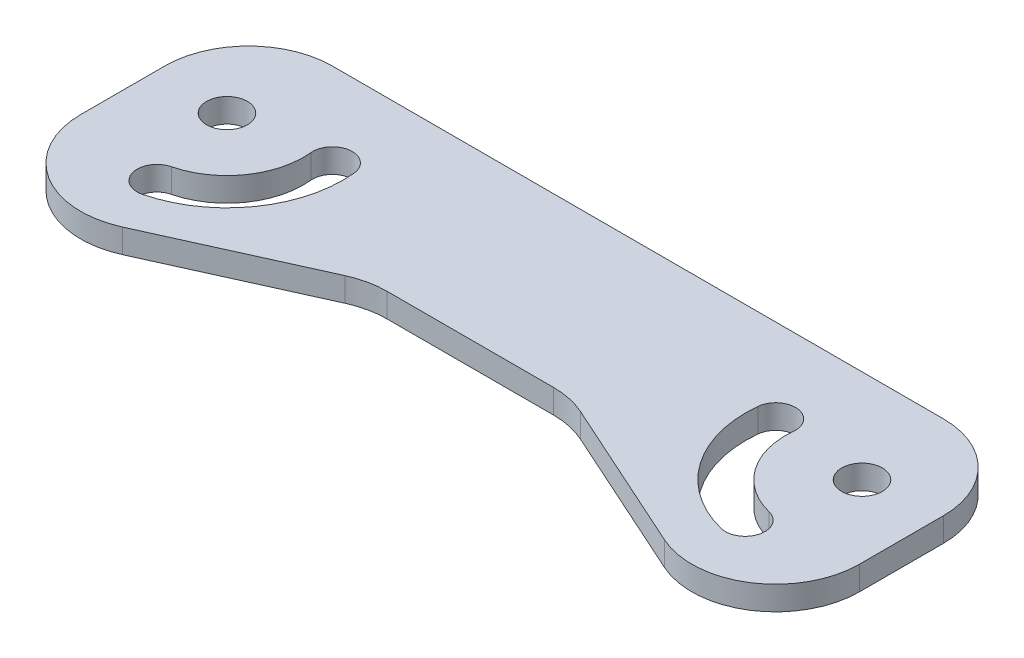
ISO-10303-21;
HEADER;
FILE_DESCRIPTION(('STEP AP214'),'2;1');
FILE_NAME('part.step','',(''),(''),'','','');
FILE_SCHEMA(('AUTOMOTIVE_DESIGN { 1 0 10303 214 1 1 1 1 }'));
ENDSEC;
DATA;
#1=APPLICATION_CONTEXT('core data for automotive mechanical design processes');
#2=APPLICATION_PROTOCOL_DEFINITION('international standard','automotive_design',2000,#1);
#3=PRODUCT_CONTEXT('',#1,'mechanical');
#4=PRODUCT('Part','Part','',(#3));
#5=PRODUCT_RELATED_PRODUCT_CATEGORY('part','',(#4));
#6=PRODUCT_DEFINITION_FORMATION('','',#4);
#7=PRODUCT_DEFINITION_CONTEXT('part definition',#1,'design');
#8=PRODUCT_DEFINITION('design','',#6,#7);
#9=PRODUCT_DEFINITION_SHAPE('','',#8);
#10=(LENGTH_UNIT() NAMED_UNIT(*) SI_UNIT(.MILLI.,.METRE.));
#11=(NAMED_UNIT(*) PLANE_ANGLE_UNIT() SI_UNIT($,.RADIAN.));
#12=(NAMED_UNIT(*) SI_UNIT($,.STERADIAN.) SOLID_ANGLE_UNIT());
#13=UNCERTAINTY_MEASURE_WITH_UNIT(LENGTH_MEASURE(1.E-05),#10,'distance_accuracy_value','');
#14=(GEOMETRIC_REPRESENTATION_CONTEXT(3) GLOBAL_UNCERTAINTY_ASSIGNED_CONTEXT((#13)) GLOBAL_UNIT_ASSIGNED_CONTEXT((#10,
#11,#12)) REPRESENTATION_CONTEXT('',''));
#15=CARTESIAN_POINT('',(0.,0.,0.));
#16=DIRECTION('',(0.,0.,1.));
#17=DIRECTION('',(1.,0.,0.));
#18=AXIS2_PLACEMENT_3D('',#15,#16,#17);
#19=CARTESIAN_POINT('',(-32.5,2.,7.));
#20=DIRECTION('',(0.,0.,-1.));
#21=DIRECTION('',(-1.,0.,0.));
#22=AXIS2_PLACEMENT_3D('',#19,#20,#21);
#23=PLANE('',#22);
#24=DIRECTION('',(1.,0.,0.));
#25=VECTOR('',#24,1.);
#26=CARTESIAN_POINT('',(-32.5,0.,7.));
#27=LINE('',#26,#25);
#28=CARTESIAN_POINT('',(-6.94407686027593,0.,7.));
#29=VERTEX_POINT('',#28);
#30=CARTESIAN_POINT('',(6.94407686027594,0.,7.));
#31=VERTEX_POINT('',#30);
#32=EDGE_CURVE('E247',#29,#31,#27,.T.);
#33=ORIENTED_EDGE('',*,*,#32,.T.);
#34=DIRECTION('',(0.,1.,0.));
#35=VECTOR('',#34,1.);
#36=CARTESIAN_POINT('',(6.94407686027594,2.,7.));
#37=LINE('',#36,#35);
#38=CARTESIAN_POINT('',(6.94407686027594,2.,7.));
#39=VERTEX_POINT('',#38);
#40=EDGE_CURVE('E347',#31,#39,#37,.T.);
#41=ORIENTED_EDGE('',*,*,#40,.T.);
#42=DIRECTION('',(1.,0.,0.));
#43=VECTOR('',#42,1.);
#44=CARTESIAN_POINT('',(-32.5,2.,7.));
#45=LINE('',#44,#43);
#46=CARTESIAN_POINT('',(-6.94407686027593,2.,7.));
#47=VERTEX_POINT('',#46);
#48=EDGE_CURVE('E253',#47,#39,#45,.T.);
#49=ORIENTED_EDGE('',*,*,#48,.F.);
#50=DIRECTION('',(0.,1.,0.));
#51=VECTOR('',#50,1.);
#52=CARTESIAN_POINT('',(-6.94407686027593,2.,7.));
#53=LINE('',#52,#51);
#54=EDGE_CURVE('E345',#47,#29,#53,.F.);
#55=ORIENTED_EDGE('',*,*,#54,.T.);
#56=EDGE_LOOP('',(#33,#41,#49,#55));
#57=FACE_BOUND('',#56,.T.);
#58=ADVANCED_FACE('F35',(#57),#23,.F.);
#59=CARTESIAN_POINT('',(32.5,2.,-7.));
#60=DIRECTION('',(-1.,0.,0.));
#61=DIRECTION('',(0.,0.,1.));
#62=AXIS2_PLACEMENT_3D('',#59,#60,#61);
#63=PLANE('',#62);
#64=DIRECTION('',(0.,0.,-1.));
#65=VECTOR('',#64,1.);
#66=CARTESIAN_POINT('',(32.5,2.,-7.));
#67=LINE('',#66,#65);
#68=CARTESIAN_POINT('',(32.5,2.,7.01260847958393));
#69=VERTEX_POINT('',#68);
#70=CARTESIAN_POINT('',(32.5,2.,0.));
#71=VERTEX_POINT('',#70);
#72=EDGE_CURVE('E243',#69,#71,#67,.T.);
#73=ORIENTED_EDGE('',*,*,#72,.F.);
#74=DIRECTION('',(0.,1.,0.));
#75=VECTOR('',#74,1.);
#76=CARTESIAN_POINT('',(32.5,0.,7.01260847958393));
#77=LINE('',#76,#75);
#78=CARTESIAN_POINT('',(32.5,0.,7.01260847958393));
#79=VERTEX_POINT('',#78);
#80=EDGE_CURVE('E276',#69,#79,#77,.F.);
#81=ORIENTED_EDGE('',*,*,#80,.T.);
#82=DIRECTION('',(0.,0.,-1.));
#83=VECTOR('',#82,1.);
#84=CARTESIAN_POINT('',(32.5,0.,-7.));
#85=LINE('',#84,#83);
#86=CARTESIAN_POINT('',(32.5,0.,0.));
#87=VERTEX_POINT('',#86);
#88=EDGE_CURVE('E256',#79,#87,#85,.T.);
#89=ORIENTED_EDGE('',*,*,#88,.T.);
#90=DIRECTION('',(0.,-1.,0.));
#91=VECTOR('',#90,1.);
#92=CARTESIAN_POINT('',(32.5,2.,0.));
#93=LINE('',#92,#91);
#94=EDGE_CURVE('E274',#87,#71,#93,.F.);
#95=ORIENTED_EDGE('',*,*,#94,.T.);
#96=EDGE_LOOP('',(#73,#81,#89,#95));
#97=FACE_BOUND('',#96,.T.);
#98=ADVANCED_FACE('F394',(#97),#63,.F.);
#99=CARTESIAN_POINT('',(-32.5,2.,-7.));
#100=DIRECTION('',(0.,0.,1.));
#101=DIRECTION('',(1.,0.,0.));
#102=AXIS2_PLACEMENT_3D('',#99,#100,#101);
#103=PLANE('',#102);
#104=DIRECTION('',(-1.,0.,0.));
#105=VECTOR('',#104,1.);
#106=CARTESIAN_POINT('',(-32.5,2.,-7.));
#107=LINE('',#106,#105);
#108=CARTESIAN_POINT('',(25.5,2.,-7.));
#109=VERTEX_POINT('',#108);
#110=CARTESIAN_POINT('',(-25.5,2.,-7.));
#111=VERTEX_POINT('',#110);
#112=EDGE_CURVE('E246',#109,#111,#107,.T.);
#113=ORIENTED_EDGE('',*,*,#112,.F.);
#114=DIRECTION('',(0.,-1.,0.));
#115=VECTOR('',#114,1.);
#116=CARTESIAN_POINT('',(25.5,2.,-7.));
#117=LINE('',#116,#115);
#118=CARTESIAN_POINT('',(25.5,0.,-7.));
#119=VERTEX_POINT('',#118);
#120=EDGE_CURVE('E332',#109,#119,#117,.T.);
#121=ORIENTED_EDGE('',*,*,#120,.T.);
#122=DIRECTION('',(-1.,0.,0.));
#123=VECTOR('',#122,1.);
#124=CARTESIAN_POINT('',(-32.5,0.,-7.));
#125=LINE('',#124,#123);
#126=CARTESIAN_POINT('',(-25.5,0.,-7.));
#127=VERTEX_POINT('',#126);
#128=EDGE_CURVE('E370',#119,#127,#125,.T.);
#129=ORIENTED_EDGE('',*,*,#128,.T.);
#130=DIRECTION('',(0.,-1.,0.));
#131=VECTOR('',#130,1.);
#132=CARTESIAN_POINT('',(-25.5,2.,-7.));
#133=LINE('',#132,#131);
#134=EDGE_CURVE('E335',#127,#111,#133,.F.);
#135=ORIENTED_EDGE('',*,*,#134,.T.);
#136=EDGE_LOOP('',(#113,#121,#129,#135));
#137=FACE_BOUND('',#136,.T.);
#138=ADVANCED_FACE('F369',(#137),#103,.F.);
#139=CARTESIAN_POINT('',(-32.5,2.,-7.));
#140=DIRECTION('',(1.,0.,0.));
#141=DIRECTION('',(0.,0.,-1.));
#142=AXIS2_PLACEMENT_3D('',#139,#140,#141);
#143=PLANE('',#142);
#144=DIRECTION('',(0.,0.,1.));
#145=VECTOR('',#144,1.);
#146=CARTESIAN_POINT('',(-32.5,0.,-7.));
#147=LINE('',#146,#145);
#148=CARTESIAN_POINT('',(-32.5,0.,0.));
#149=VERTEX_POINT('',#148);
#150=CARTESIAN_POINT('',(-32.5,0.,7.01260847958394));
#151=VERTEX_POINT('',#150);
#152=EDGE_CURVE('E281',#149,#151,#147,.T.);
#153=ORIENTED_EDGE('',*,*,#152,.T.);
#154=DIRECTION('',(0.,1.,0.));
#155=VECTOR('',#154,1.);
#156=CARTESIAN_POINT('',(-32.5,2.,7.01260847958394));
#157=LINE('',#156,#155);
#158=CARTESIAN_POINT('',(-32.5,2.,7.01260847958394));
#159=VERTEX_POINT('',#158);
#160=EDGE_CURVE('E364',#151,#159,#157,.T.);
#161=ORIENTED_EDGE('',*,*,#160,.T.);
#162=DIRECTION('',(0.,0.,1.));
#163=VECTOR('',#162,1.);
#164=CARTESIAN_POINT('',(-32.5,2.,-7.));
#165=LINE('',#164,#163);
#166=CARTESIAN_POINT('',(-32.5,2.,0.));
#167=VERTEX_POINT('',#166);
#168=EDGE_CURVE('E250',#167,#159,#165,.T.);
#169=ORIENTED_EDGE('',*,*,#168,.F.);
#170=DIRECTION('',(0.,-1.,0.));
#171=VECTOR('',#170,1.);
#172=CARTESIAN_POINT('',(-32.5,2.,0.));
#173=LINE('',#172,#171);
#174=EDGE_CURVE('E361',#167,#149,#173,.T.);
#175=ORIENTED_EDGE('',*,*,#174,.T.);
#176=EDGE_LOOP('',(#153,#161,#169,#175));
#177=FACE_BOUND('',#176,.T.);
#178=ADVANCED_FACE('F378',(#177),#143,.F.);
#179=CARTESIAN_POINT('',(0.,2.,0.));
#180=DIRECTION('',(0.,1.,0.));
#181=DIRECTION('',(0.,0.,1.));
#182=AXIS2_PLACEMENT_3D('',#179,#180,#181);
#183=PLANE('',#182);
#184=CARTESIAN_POINT('',(24.55,2.,8.59983974194342));
#185=DIRECTION('',(0.,1.,0.));
#186=DIRECTION('',(0.,0.,-1.));
#187=AXIS2_PLACEMENT_3D('',#184,#185,#186);
#188=CIRCLE('',#187,1.65000000000004);
#189=CARTESIAN_POINT('',(24.1498084800624,2.,10.2005729325064));
#190=VERTEX_POINT('',#189);
#191=CARTESIAN_POINT('',(24.9501910533109,2.,6.99910643472132));
#192=VERTEX_POINT('',#191);
#193=EDGE_CURVE('E194',#190,#192,#188,.T.);
#194=ORIENTED_EDGE('',*,*,#193,.F.);
#195=CARTESIAN_POINT('',(26.5,2.,0.800000000000002));
#196=DIRECTION('',(0.,1.,0.));
#197=DIRECTION('',(0.,0.,-1.));
#198=AXIS2_PLACEMENT_3D('',#195,#196,#197);
#199=CIRCLE('',#198,9.68990049689671);
#200=CARTESIAN_POINT('',(16.8581886361535,2.,-0.164181136384643));
#201=VERTEX_POINT('',#200);
#202=EDGE_CURVE('E199',#201,#190,#199,.T.);
#203=ORIENTED_EDGE('',*,*,#202,.F.);
#204=CARTESIAN_POINT('',(18.5,2.,0.));
#205=DIRECTION('',(0.,1.,0.));
#206=DIRECTION('',(0.,0.,-1.));
#207=AXIS2_PLACEMENT_3D('',#204,#205,#206);
#208=CIRCLE('',#207,1.65);
#209=CARTESIAN_POINT('',(20.1418113638465,2.,0.16418113638465));
#210=VERTEX_POINT('',#209);
#211=EDGE_CURVE('E178',#210,#201,#208,.T.);
#212=ORIENTED_EDGE('',*,*,#211,.F.);
#213=CARTESIAN_POINT('',(26.5,2.,0.800000000000002));
#214=DIRECTION('',(0.,-1.,0.));
#215=DIRECTION('',(0.,0.,-1.));
#216=AXIS2_PLACEMENT_3D('',#213,#214,#215);
#217=CIRCLE('',#216,6.38990049689672);
#218=EDGE_CURVE('E189',#192,#210,#217,.T.);
#219=ORIENTED_EDGE('',*,*,#218,.F.);
#220=EDGE_LOOP('',(#194,#203,#212,#219));
#221=FACE_BOUND('',#220,.T.);
#222=CARTESIAN_POINT('',(-24.55,2.,8.59983974194342));
#223=DIRECTION('',(0.,1.,0.));
#224=DIRECTION('',(0.,0.,1.));
#225=AXIS2_PLACEMENT_3D('',#222,#223,#224);
#226=CIRCLE('',#225,1.65000000000004);
#227=CARTESIAN_POINT('',(-24.9501910533109,2.,6.99910643472132));
#228=VERTEX_POINT('',#227);
#229=CARTESIAN_POINT('',(-24.1498084800624,2.,10.2005729325064));
#230=VERTEX_POINT('',#229);
#231=EDGE_CURVE('E206',#228,#230,#226,.T.);
#232=ORIENTED_EDGE('',*,*,#231,.F.);
#233=CARTESIAN_POINT('',(-26.5,2.,0.800000000000002));
#234=DIRECTION('',(0.,-1.,0.));
#235=DIRECTION('',(0.,0.,1.));
#236=AXIS2_PLACEMENT_3D('',#233,#234,#235);
#237=CIRCLE('',#236,6.38990049689672);
#238=CARTESIAN_POINT('',(-20.1418113638465,2.,0.16418113638465));
#239=VERTEX_POINT('',#238);
#240=EDGE_CURVE('E216',#239,#228,#237,.T.);
#241=ORIENTED_EDGE('',*,*,#240,.F.);
#242=CARTESIAN_POINT('',(-18.5,2.,0.));
#243=DIRECTION('',(0.,1.,0.));
#244=DIRECTION('',(0.,0.,1.));
#245=AXIS2_PLACEMENT_3D('',#242,#243,#244);
#246=CIRCLE('',#245,1.65);
#247=CARTESIAN_POINT('',(-16.8581886361535,2.,-0.164181136384646));
#248=VERTEX_POINT('',#247);
#249=EDGE_CURVE('E213',#248,#239,#246,.T.);
#250=ORIENTED_EDGE('',*,*,#249,.F.);
#251=CARTESIAN_POINT('',(-26.5,2.,0.800000000000002));
#252=DIRECTION('',(0.,1.,0.));
#253=DIRECTION('',(0.,0.,1.));
#254=AXIS2_PLACEMENT_3D('',#251,#252,#253);
#255=CIRCLE('',#254,9.68990049689671);
#256=EDGE_CURVE('E210',#230,#248,#255,.T.);
#257=ORIENTED_EDGE('',*,*,#256,.F.);
#258=EDGE_LOOP('',(#232,#241,#250,#257));
#259=FACE_BOUND('',#258,.T.);
#260=CARTESIAN_POINT('',(-26.5,2.,0.800000000000002));
#261=DIRECTION('',(0.,1.,0.));
#262=DIRECTION('',(0.,0.,1.));
#263=AXIS2_PLACEMENT_3D('',#260,#261,#262);
#264=CIRCLE('',#263,1.69999999999999);
#265=CARTESIAN_POINT('',(-26.5,2.,2.49999999999999));
#266=VERTEX_POINT('',#265);
#267=EDGE_CURVE('E222',#266,#266,#264,.T.);
#268=ORIENTED_EDGE('',*,*,#267,.F.);
#269=EDGE_LOOP('',(#268));
#270=FACE_BOUND('',#269,.T.);
#271=CARTESIAN_POINT('',(26.5,2.,0.800000000000002));
#272=DIRECTION('',(0.,1.,0.));
#273=DIRECTION('',(0.,0.,1.));
#274=AXIS2_PLACEMENT_3D('',#271,#272,#273);
#275=CIRCLE('',#274,1.69999999999999);
#276=CARTESIAN_POINT('',(26.5,2.,2.49999999999999));
#277=VERTEX_POINT('',#276);
#278=EDGE_CURVE('E232',#277,#277,#275,.T.);
#279=ORIENTED_EDGE('',*,*,#278,.F.);
#280=EDGE_LOOP('',(#279));
#281=FACE_BOUND('',#280,.T.);
#282=DIRECTION('',(0.911531046638268,0.,0.41123126220479));
#283=VECTOR('',#282,1.);
#284=CARTESIAN_POINT('',(32.5,2.,17.85));
#285=LINE('',#284,#283);
#286=CARTESIAN_POINT('',(9.82269569570947,2.,7.61928267353213));
#287=VERTEX_POINT('',#286);
#288=CARTESIAN_POINT('',(22.6213811645665,2.,13.3933258060518));
#289=VERTEX_POINT('',#288);
#290=EDGE_CURVE('E240',#287,#289,#285,.T.);
#291=ORIENTED_EDGE('',*,*,#290,.T.);
#292=CARTESIAN_POINT('',(25.5,2.,7.01260847958393));
#293=DIRECTION('',(0.,1.,0.));
#294=DIRECTION('',(0.,0.,1.));
#295=AXIS2_PLACEMENT_3D('',#292,#293,#294);
#296=CIRCLE('',#295,7.);
#297=EDGE_CURVE('E272',#289,#69,#296,.T.);
#298=ORIENTED_EDGE('',*,*,#297,.T.);
#299=ORIENTED_EDGE('',*,*,#72,.T.);
#300=CARTESIAN_POINT('',(25.5,2.,0.));
#301=DIRECTION('',(0.,1.,0.));
#302=DIRECTION('',(0.,0.,1.));
#303=AXIS2_PLACEMENT_3D('',#300,#301,#302);
#304=CIRCLE('',#303,7.);
#305=EDGE_CURVE('E267',#71,#109,#304,.T.);
#306=ORIENTED_EDGE('',*,*,#305,.T.);
#307=ORIENTED_EDGE('',*,*,#112,.T.);
#308=CARTESIAN_POINT('',(-25.5,2.,0.));
#309=DIRECTION('',(0.,1.,0.));
#310=DIRECTION('',(0.,0.,1.));
#311=AXIS2_PLACEMENT_3D('',#308,#309,#310);
#312=CIRCLE('',#311,7.);
#313=EDGE_CURVE('E265',#111,#167,#312,.T.);
#314=ORIENTED_EDGE('',*,*,#313,.T.);
#315=ORIENTED_EDGE('',*,*,#168,.T.);
#316=CARTESIAN_POINT('',(-25.5,2.,7.01260847958395));
#317=DIRECTION('',(0.,1.,0.));
#318=DIRECTION('',(0.,0.,1.));
#319=AXIS2_PLACEMENT_3D('',#316,#317,#318);
#320=CIRCLE('',#319,7.);
#321=CARTESIAN_POINT('',(-22.6213811645665,2.,13.3933258060518));
#322=VERTEX_POINT('',#321);
#323=EDGE_CURVE('E270',#159,#322,#320,.T.);
#324=ORIENTED_EDGE('',*,*,#323,.T.);
#325=DIRECTION('',(0.911531046638268,0.,-0.41123126220479));
#326=VECTOR('',#325,1.);
#327=CARTESIAN_POINT('',(-32.5,2.,17.85));
#328=LINE('',#327,#326);
#329=CARTESIAN_POINT('',(-9.82269569570946,2.,7.61928267353213));
#330=VERTEX_POINT('',#329);
#331=EDGE_CURVE('E239',#322,#330,#328,.T.);
#332=ORIENTED_EDGE('',*,*,#331,.T.);
#333=CARTESIAN_POINT('',(-6.94407686027593,2.,14.));
#334=DIRECTION('',(0.,1.,0.));
#335=DIRECTION('',(0.,0.,1.));
#336=AXIS2_PLACEMENT_3D('',#333,#334,#335);
#337=CIRCLE('',#336,7.);
#338=EDGE_CURVE('E43',#330,#47,#337,.F.);
#339=ORIENTED_EDGE('',*,*,#338,.T.);
#340=ORIENTED_EDGE('',*,*,#48,.T.);
#341=CARTESIAN_POINT('',(6.94407686027594,2.,14.));
#342=DIRECTION('',(0.,1.,0.));
#343=DIRECTION('',(0.,0.,1.));
#344=AXIS2_PLACEMENT_3D('',#341,#342,#343);
#345=CIRCLE('',#344,7.);
#346=EDGE_CURVE('E326',#39,#287,#345,.F.);
#347=ORIENTED_EDGE('',*,*,#346,.T.);
#348=EDGE_LOOP('',(#291,#298,#299,#306,#307,#314,#315,#324,#332,#339,#340,#347));
#349=FACE_BOUND('',#348,.T.);
#350=ADVANCED_FACE('F196',(#221,#259,#270,#281,#349),#183,.T.);
#351=CARTESIAN_POINT('',(0.,0.,0.));
#352=DIRECTION('',(0.,1.,0.));
#353=DIRECTION('',(0.,0.,1.));
#354=AXIS2_PLACEMENT_3D('',#351,#352,#353);
#355=PLANE('',#354);
#356=CARTESIAN_POINT('',(26.5,0.,0.800000000000002));
#357=DIRECTION('',(0.,1.,0.));
#358=DIRECTION('',(0.,0.,1.));
#359=AXIS2_PLACEMENT_3D('',#356,#357,#358);
#360=CIRCLE('',#359,9.68990049689671);
#361=CARTESIAN_POINT('',(16.8581886361535,0.,-0.164181136384643));
#362=VERTEX_POINT('',#361);
#363=CARTESIAN_POINT('',(24.1498084800624,0.,10.2005729325064));
#364=VERTEX_POINT('',#363);
#365=EDGE_CURVE('E308',#362,#364,#360,.T.);
#366=ORIENTED_EDGE('',*,*,#365,.T.);
#367=CARTESIAN_POINT('',(24.55,0.,8.59983974194342));
#368=DIRECTION('',(0.,1.,0.));
#369=DIRECTION('',(0.,0.,1.));
#370=AXIS2_PLACEMENT_3D('',#367,#368,#369);
#371=CIRCLE('',#370,1.65000000000004);
#372=CARTESIAN_POINT('',(24.9501910533109,0.,6.99910643472132));
#373=VERTEX_POINT('',#372);
#374=EDGE_CURVE('E311',#364,#373,#371,.T.);
#375=ORIENTED_EDGE('',*,*,#374,.T.);
#376=CARTESIAN_POINT('',(26.5,0.,0.800000000000002));
#377=DIRECTION('',(0.,1.,0.));
#378=DIRECTION('',(0.,0.,1.));
#379=AXIS2_PLACEMENT_3D('',#376,#377,#378);
#380=CIRCLE('',#379,6.38990049689672);
#381=CARTESIAN_POINT('',(20.1418113638465,0.,0.164181136384649));
#382=VERTEX_POINT('',#381);
#383=EDGE_CURVE('E305',#373,#382,#380,.F.);
#384=ORIENTED_EDGE('',*,*,#383,.T.);
#385=CARTESIAN_POINT('',(18.5,0.,0.));
#386=DIRECTION('',(0.,1.,0.));
#387=DIRECTION('',(0.,0.,1.));
#388=AXIS2_PLACEMENT_3D('',#385,#386,#387);
#389=CIRCLE('',#388,1.65);
#390=EDGE_CURVE('E181',#382,#362,#389,.T.);
#391=ORIENTED_EDGE('',*,*,#390,.T.);
#392=EDGE_LOOP('',(#366,#375,#384,#391));
#393=FACE_BOUND('',#392,.T.);
#394=CARTESIAN_POINT('',(-26.5,0.,0.800000000000002));
#395=DIRECTION('',(0.,1.,0.));
#396=DIRECTION('',(0.,0.,1.));
#397=AXIS2_PLACEMENT_3D('',#394,#395,#396);
#398=CIRCLE('',#397,6.38990049689672);
#399=CARTESIAN_POINT('',(-20.1418113638465,0.,0.16418113638465));
#400=VERTEX_POINT('',#399);
#401=CARTESIAN_POINT('',(-24.9501910533109,0.,6.99910643472132));
#402=VERTEX_POINT('',#401);
#403=EDGE_CURVE('E299',#400,#402,#398,.F.);
#404=ORIENTED_EDGE('',*,*,#403,.T.);
#405=CARTESIAN_POINT('',(-24.55,0.,8.59983974194342));
#406=DIRECTION('',(0.,1.,0.));
#407=DIRECTION('',(0.,0.,1.));
#408=AXIS2_PLACEMENT_3D('',#405,#406,#407);
#409=CIRCLE('',#408,1.65000000000004);
#410=CARTESIAN_POINT('',(-24.1498084800624,0.,10.2005729325064));
#411=VERTEX_POINT('',#410);
#412=EDGE_CURVE('E302',#402,#411,#409,.T.);
#413=ORIENTED_EDGE('',*,*,#412,.T.);
#414=CARTESIAN_POINT('',(-26.5,0.,0.800000000000002));
#415=DIRECTION('',(0.,1.,0.));
#416=DIRECTION('',(0.,0.,1.));
#417=AXIS2_PLACEMENT_3D('',#414,#415,#416);
#418=CIRCLE('',#417,9.68990049689671);
#419=CARTESIAN_POINT('',(-16.8581886361535,0.,-0.164181136384646));
#420=VERTEX_POINT('',#419);
#421=EDGE_CURVE('E262',#411,#420,#418,.T.);
#422=ORIENTED_EDGE('',*,*,#421,.T.);
#423=CARTESIAN_POINT('',(-18.5,0.,0.));
#424=DIRECTION('',(0.,1.,0.));
#425=DIRECTION('',(0.,0.,1.));
#426=AXIS2_PLACEMENT_3D('',#423,#424,#425);
#427=CIRCLE('',#426,1.65);
#428=EDGE_CURVE('E296',#420,#400,#427,.T.);
#429=ORIENTED_EDGE('',*,*,#428,.T.);
#430=EDGE_LOOP('',(#404,#413,#422,#429));
#431=FACE_BOUND('',#430,.T.);
#432=CARTESIAN_POINT('',(-26.5,0.,0.800000000000002));
#433=DIRECTION('',(0.,1.,0.));
#434=DIRECTION('',(0.,0.,1.));
#435=AXIS2_PLACEMENT_3D('',#432,#433,#434);
#436=CIRCLE('',#435,1.69999999999999);
#437=CARTESIAN_POINT('',(-26.5,0.,2.5));
#438=VERTEX_POINT('',#437);
#439=EDGE_CURVE('E231',#438,#438,#436,.T.);
#440=ORIENTED_EDGE('',*,*,#439,.T.);
#441=EDGE_LOOP('',(#440));
#442=FACE_BOUND('',#441,.T.);
#443=CARTESIAN_POINT('',(26.5,0.,0.800000000000002));
#444=DIRECTION('',(0.,1.,0.));
#445=DIRECTION('',(0.,0.,1.));
#446=AXIS2_PLACEMENT_3D('',#443,#444,#445);
#447=CIRCLE('',#446,1.69999999999999);
#448=CARTESIAN_POINT('',(26.5,0.,2.5));
#449=VERTEX_POINT('',#448);
#450=EDGE_CURVE('E235',#449,#449,#447,.T.);
#451=ORIENTED_EDGE('',*,*,#450,.T.);
#452=EDGE_LOOP('',(#451));
#453=FACE_BOUND('',#452,.T.);
#454=ORIENTED_EDGE('',*,*,#88,.F.);
#455=CARTESIAN_POINT('',(25.5,0.,7.01260847958393));
#456=DIRECTION('',(0.,1.,0.));
#457=DIRECTION('',(0.,0.,1.));
#458=AXIS2_PLACEMENT_3D('',#455,#456,#457);
#459=CIRCLE('',#458,7.);
#460=CARTESIAN_POINT('',(22.6213811645665,0.,13.3933258060518));
#461=VERTEX_POINT('',#460);
#462=EDGE_CURVE('E350',#79,#461,#459,.F.);
#463=ORIENTED_EDGE('',*,*,#462,.T.);
#464=DIRECTION('',(-0.911531046638268,0.,-0.41123126220479));
#465=VECTOR('',#464,1.);
#466=CARTESIAN_POINT('',(32.5,0.,17.85));
#467=LINE('',#466,#465);
#468=CARTESIAN_POINT('',(9.82269569570947,0.,7.61928267353213));
#469=VERTEX_POINT('',#468);
#470=EDGE_CURVE('E236',#461,#469,#467,.T.);
#471=ORIENTED_EDGE('',*,*,#470,.T.);
#472=CARTESIAN_POINT('',(6.94407686027594,0.,14.));
#473=DIRECTION('',(0.,1.,0.));
#474=DIRECTION('',(0.,0.,1.));
#475=AXIS2_PLACEMENT_3D('',#472,#473,#474);
#476=CIRCLE('',#475,7.);
#477=EDGE_CURVE('E331',#469,#31,#476,.T.);
#478=ORIENTED_EDGE('',*,*,#477,.T.);
#479=ORIENTED_EDGE('',*,*,#32,.F.);
#480=CARTESIAN_POINT('',(-6.94407686027593,0.,14.));
#481=DIRECTION('',(0.,1.,0.));
#482=DIRECTION('',(0.,0.,1.));
#483=AXIS2_PLACEMENT_3D('',#480,#481,#482);
#484=CIRCLE('',#483,7.);
#485=CARTESIAN_POINT('',(-9.82269569570946,0.,7.61928267353213));
#486=VERTEX_POINT('',#485);
#487=EDGE_CURVE('E11',#29,#486,#484,.T.);
#488=ORIENTED_EDGE('',*,*,#487,.T.);
#489=DIRECTION('',(-0.911531046638268,0.,0.41123126220479));
#490=VECTOR('',#489,1.);
#491=CARTESIAN_POINT('',(-32.5,0.,17.85));
#492=LINE('',#491,#490);
#493=CARTESIAN_POINT('',(-22.6213811645665,0.,13.3933258060518));
#494=VERTEX_POINT('',#493);
#495=EDGE_CURVE('E282',#486,#494,#492,.T.);
#496=ORIENTED_EDGE('',*,*,#495,.T.);
#497=CARTESIAN_POINT('',(-25.5,0.,7.01260847958395));
#498=DIRECTION('',(0.,1.,0.));
#499=DIRECTION('',(0.,0.,1.));
#500=AXIS2_PLACEMENT_3D('',#497,#498,#499);
#501=CIRCLE('',#500,7.);
#502=EDGE_CURVE('E354',#494,#151,#501,.F.);
#503=ORIENTED_EDGE('',*,*,#502,.T.);
#504=ORIENTED_EDGE('',*,*,#152,.F.);
#505=CARTESIAN_POINT('',(-25.5,0.,0.));
#506=DIRECTION('',(0.,1.,0.));
#507=DIRECTION('',(0.,0.,1.));
#508=AXIS2_PLACEMENT_3D('',#505,#506,#507);
#509=CIRCLE('',#508,7.);
#510=EDGE_CURVE('E50',#149,#127,#509,.F.);
#511=ORIENTED_EDGE('',*,*,#510,.T.);
#512=ORIENTED_EDGE('',*,*,#128,.F.);
#513=CARTESIAN_POINT('',(25.5,0.,0.));
#514=DIRECTION('',(0.,1.,0.));
#515=DIRECTION('',(0.,0.,1.));
#516=AXIS2_PLACEMENT_3D('',#513,#514,#515);
#517=CIRCLE('',#516,7.);
#518=EDGE_CURVE('E58',#119,#87,#517,.F.);
#519=ORIENTED_EDGE('',*,*,#518,.T.);
#520=EDGE_LOOP('',(#454,#463,#471,#478,#479,#488,#496,#503,#504,#511,#512,#519));
#521=FACE_BOUND('',#520,.T.);
#522=ADVANCED_FACE('F381',(#393,#431,#442,#453,#521),#355,.F.);
#523=CARTESIAN_POINT('',(-32.5,-26.3841808665723,17.85));
#524=DIRECTION('',(0.41123126220479,0.,0.911531046638268));
#525=DIRECTION('',(0.911531046638268,0.,-0.41123126220479));
#526=AXIS2_PLACEMENT_3D('',#523,#524,#525);
#527=PLANE('',#526);
#528=ORIENTED_EDGE('',*,*,#495,.F.);
#529=DIRECTION('',(0.,1.,0.));
#530=VECTOR('',#529,1.);
#531=CARTESIAN_POINT('',(-9.82269569570946,-26.3841808665723,7.61928267353213));
#532=LINE('',#531,#530);
#533=EDGE_CURVE('E359',#486,#330,#532,.T.);
#534=ORIENTED_EDGE('',*,*,#533,.T.);
#535=ORIENTED_EDGE('',*,*,#331,.F.);
#536=DIRECTION('',(0.,1.,0.));
#537=VECTOR('',#536,1.);
#538=CARTESIAN_POINT('',(-22.6213811645665,0.,13.3933258060518));
#539=LINE('',#538,#537);
#540=EDGE_CURVE('E352',#322,#494,#539,.F.);
#541=ORIENTED_EDGE('',*,*,#540,.T.);
#542=EDGE_LOOP('',(#528,#534,#535,#541));
#543=FACE_BOUND('',#542,.T.);
#544=ADVANCED_FACE('F546',(#543),#527,.T.);
#545=CARTESIAN_POINT('',(32.5,-26.3841808665723,17.85));
#546=DIRECTION('',(-0.41123126220479,0.,0.911531046638268));
#547=DIRECTION('',(0.911531046638268,0.,0.41123126220479));
#548=AXIS2_PLACEMENT_3D('',#545,#546,#547);
#549=PLANE('',#548);
#550=ORIENTED_EDGE('',*,*,#470,.F.);
#551=DIRECTION('',(0.,1.,0.));
#552=VECTOR('',#551,1.);
#553=CARTESIAN_POINT('',(22.6213811645665,2.,13.3933258060518));
#554=LINE('',#553,#552);
#555=EDGE_CURVE('E268',#461,#289,#554,.T.);
#556=ORIENTED_EDGE('',*,*,#555,.T.);
#557=ORIENTED_EDGE('',*,*,#290,.F.);
#558=DIRECTION('',(0.,1.,0.));
#559=VECTOR('',#558,1.);
#560=CARTESIAN_POINT('',(9.82269569570947,-26.3841808665723,7.61928267353213));
#561=LINE('',#560,#559);
#562=EDGE_CURVE('E314',#287,#469,#561,.F.);
#563=ORIENTED_EDGE('',*,*,#562,.T.);
#564=EDGE_LOOP('',(#550,#556,#557,#563));
#565=FACE_BOUND('',#564,.T.);
#566=ADVANCED_FACE('F320',(#565),#549,.T.);
#567=CARTESIAN_POINT('',(26.5,2.,0.800000000000002));
#568=DIRECTION('',(0.,1.,0.));
#569=DIRECTION('',(0.,0.,1.));
#570=AXIS2_PLACEMENT_3D('',#567,#568,#569);
#571=CYLINDRICAL_SURFACE('',#570,1.69999999999999);
#572=ORIENTED_EDGE('',*,*,#278,.T.);
#573=EDGE_LOOP('',(#572));
#574=FACE_BOUND('',#573,.T.);
#575=ORIENTED_EDGE('',*,*,#450,.F.);
#576=EDGE_LOOP('',(#575));
#577=FACE_BOUND('',#576,.T.);
#578=ADVANCED_FACE('F530',(#574,#577),#571,.F.);
#579=CARTESIAN_POINT('',(-26.5,2.,0.800000000000002));
#580=DIRECTION('',(0.,1.,0.));
#581=DIRECTION('',(0.,0.,1.));
#582=AXIS2_PLACEMENT_3D('',#579,#580,#581);
#583=CYLINDRICAL_SURFACE('',#582,1.69999999999999);
#584=ORIENTED_EDGE('',*,*,#267,.T.);
#585=EDGE_LOOP('',(#584));
#586=FACE_BOUND('',#585,.T.);
#587=ORIENTED_EDGE('',*,*,#439,.F.);
#588=EDGE_LOOP('',(#587));
#589=FACE_BOUND('',#588,.T.);
#590=ADVANCED_FACE('F521',(#586,#589),#583,.F.);
#591=CARTESIAN_POINT('',(-24.55,-5.00000000001367E-05,8.59983974194342));
#592=DIRECTION('',(0.,1.,0.));
#593=DIRECTION('',(0.,0.,1.));
#594=AXIS2_PLACEMENT_3D('',#591,#592,#593);
#595=CYLINDRICAL_SURFACE('',#594,1.65000000000004);
#596=DIRECTION('',(0.,1.,0.));
#597=VECTOR('',#596,1.);
#598=CARTESIAN_POINT('',(-24.9501910533109,-5.00000000001367E-05,6.99910643472132));
#599=LINE('',#598,#597);
#600=EDGE_CURVE('E220',#402,#228,#599,.T.);
#601=ORIENTED_EDGE('',*,*,#600,.T.);
#602=ORIENTED_EDGE('',*,*,#231,.T.);
#603=DIRECTION('',(0.,1.,0.));
#604=VECTOR('',#603,1.);
#605=CARTESIAN_POINT('',(-24.1498084800624,-5.00000000001367E-05,10.2005729325064));
#606=LINE('',#605,#604);
#607=EDGE_CURVE('E219',#411,#230,#606,.T.);
#608=ORIENTED_EDGE('',*,*,#607,.F.);
#609=ORIENTED_EDGE('',*,*,#412,.F.);
#610=EDGE_LOOP('',(#601,#602,#608,#609));
#611=FACE_BOUND('',#610,.T.);
#612=ADVANCED_FACE('F512',(#611),#595,.F.);
#613=CARTESIAN_POINT('',(-26.5,-5.00000000001367E-05,0.800000000000002));
#614=DIRECTION('',(0.,1.,0.));
#615=DIRECTION('',(0.,0.,1.));
#616=AXIS2_PLACEMENT_3D('',#613,#614,#615);
#617=CYLINDRICAL_SURFACE('',#616,6.38990049689672);
#618=DIRECTION('',(0.,1.,0.));
#619=VECTOR('',#618,1.);
#620=CARTESIAN_POINT('',(-20.1418113638465,-5.00000000001367E-05,0.16418113638465));
#621=LINE('',#620,#619);
#622=EDGE_CURVE('E223',#400,#239,#621,.T.);
#623=ORIENTED_EDGE('',*,*,#622,.T.);
#624=ORIENTED_EDGE('',*,*,#240,.T.);
#625=ORIENTED_EDGE('',*,*,#600,.F.);
#626=ORIENTED_EDGE('',*,*,#403,.F.);
#627=EDGE_LOOP('',(#623,#624,#625,#626));
#628=FACE_BOUND('',#627,.T.);
#629=ADVANCED_FACE('F503',(#628),#617,.T.);
#630=CARTESIAN_POINT('',(-18.5,-5.00000000001367E-05,0.));
#631=DIRECTION('',(0.,1.,0.));
#632=DIRECTION('',(0.,0.,1.));
#633=AXIS2_PLACEMENT_3D('',#630,#631,#632);
#634=CYLINDRICAL_SURFACE('',#633,1.65);
#635=DIRECTION('',(0.,1.,0.));
#636=VECTOR('',#635,1.);
#637=CARTESIAN_POINT('',(-16.8581886361535,-5.00000000001367E-05,-0.164181136384646));
#638=LINE('',#637,#636);
#639=EDGE_CURVE('E225',#420,#248,#638,.T.);
#640=ORIENTED_EDGE('',*,*,#639,.T.);
#641=ORIENTED_EDGE('',*,*,#249,.T.);
#642=ORIENTED_EDGE('',*,*,#622,.F.);
#643=ORIENTED_EDGE('',*,*,#428,.F.);
#644=EDGE_LOOP('',(#640,#641,#642,#643));
#645=FACE_BOUND('',#644,.T.);
#646=ADVANCED_FACE('F494',(#645),#634,.F.);
#647=CARTESIAN_POINT('',(-26.5,-5.00000000001367E-05,0.800000000000002));
#648=DIRECTION('',(0.,1.,0.));
#649=DIRECTION('',(0.,0.,1.));
#650=AXIS2_PLACEMENT_3D('',#647,#648,#649);
#651=CYLINDRICAL_SURFACE('',#650,9.68990049689671);
#652=ORIENTED_EDGE('',*,*,#607,.T.);
#653=ORIENTED_EDGE('',*,*,#256,.T.);
#654=ORIENTED_EDGE('',*,*,#639,.F.);
#655=ORIENTED_EDGE('',*,*,#421,.F.);
#656=EDGE_LOOP('',(#652,#653,#654,#655));
#657=FACE_BOUND('',#656,.T.);
#658=ADVANCED_FACE('F485',(#657),#651,.F.);
#659=CARTESIAN_POINT('',(24.55,-5.00000000001367E-05,8.59983974194342));
#660=DIRECTION('',(0.,1.,0.));
#661=DIRECTION('',(0.,0.,1.));
#662=AXIS2_PLACEMENT_3D('',#659,#660,#661);
#663=CYLINDRICAL_SURFACE('',#662,1.65000000000004);
#664=DIRECTION('',(0.,1.,0.));
#665=VECTOR('',#664,1.);
#666=CARTESIAN_POINT('',(24.1498084800624,-5.00000000001367E-05,10.2005729325064));
#667=LINE('',#666,#665);
#668=EDGE_CURVE('E204',#364,#190,#667,.T.);
#669=ORIENTED_EDGE('',*,*,#668,.T.);
#670=ORIENTED_EDGE('',*,*,#193,.T.);
#671=DIRECTION('',(0.,1.,0.));
#672=VECTOR('',#671,1.);
#673=CARTESIAN_POINT('',(24.9501910533109,-5.00000000001367E-05,6.99910643472132));
#674=LINE('',#673,#672);
#675=EDGE_CURVE('E185',#373,#192,#674,.T.);
#676=ORIENTED_EDGE('',*,*,#675,.F.);
#677=ORIENTED_EDGE('',*,*,#374,.F.);
#678=EDGE_LOOP('',(#669,#670,#676,#677));
#679=FACE_BOUND('',#678,.T.);
#680=ADVANCED_FACE('F476',(#679),#663,.F.);
#681=CARTESIAN_POINT('',(26.5,-5.00000000001367E-05,0.800000000000002));
#682=DIRECTION('',(0.,1.,0.));
#683=DIRECTION('',(0.,0.,1.));
#684=AXIS2_PLACEMENT_3D('',#681,#682,#683);
#685=CYLINDRICAL_SURFACE('',#684,9.68990049689671);
#686=DIRECTION('',(0.,1.,0.));
#687=VECTOR('',#686,1.);
#688=CARTESIAN_POINT('',(16.8581886361535,-5.00000000001367E-05,-0.164181136384643));
#689=LINE('',#688,#687);
#690=EDGE_CURVE('E184',#362,#201,#689,.T.);
#691=ORIENTED_EDGE('',*,*,#690,.T.);
#692=ORIENTED_EDGE('',*,*,#202,.T.);
#693=ORIENTED_EDGE('',*,*,#668,.F.);
#694=ORIENTED_EDGE('',*,*,#365,.F.);
#695=EDGE_LOOP('',(#691,#692,#693,#694));
#696=FACE_BOUND('',#695,.T.);
#697=ADVANCED_FACE('F468',(#696),#685,.F.);
#698=CARTESIAN_POINT('',(18.5,-5.00000000001367E-05,0.));
#699=DIRECTION('',(0.,1.,0.));
#700=DIRECTION('',(0.,0.,1.));
#701=AXIS2_PLACEMENT_3D('',#698,#699,#700);
#702=CYLINDRICAL_SURFACE('',#701,1.65);
#703=DIRECTION('',(0.,1.,0.));
#704=VECTOR('',#703,1.);
#705=CARTESIAN_POINT('',(20.1418113638465,-5.00000000001367E-05,0.16418113638465));
#706=LINE('',#705,#704);
#707=EDGE_CURVE('E173',#382,#210,#706,.T.);
#708=ORIENTED_EDGE('',*,*,#707,.T.);
#709=ORIENTED_EDGE('',*,*,#211,.T.);
#710=ORIENTED_EDGE('',*,*,#690,.F.);
#711=ORIENTED_EDGE('',*,*,#390,.F.);
#712=EDGE_LOOP('',(#708,#709,#710,#711));
#713=FACE_BOUND('',#712,.T.);
#714=ADVANCED_FACE('F175',(#713),#702,.F.);
#715=CARTESIAN_POINT('',(26.5,-5.00000000001367E-05,0.800000000000002));
#716=DIRECTION('',(0.,1.,0.));
#717=DIRECTION('',(0.,0.,1.));
#718=AXIS2_PLACEMENT_3D('',#715,#716,#717);
#719=CYLINDRICAL_SURFACE('',#718,6.38990049689672);
#720=ORIENTED_EDGE('',*,*,#675,.T.);
#721=ORIENTED_EDGE('',*,*,#218,.T.);
#722=ORIENTED_EDGE('',*,*,#707,.F.);
#723=ORIENTED_EDGE('',*,*,#383,.F.);
#724=EDGE_LOOP('',(#720,#721,#722,#723));
#725=FACE_BOUND('',#724,.T.);
#726=ADVANCED_FACE('F190',(#725),#719,.T.);
#727=CARTESIAN_POINT('',(25.5,-26.3841808665723,7.01260847958393));
#728=DIRECTION('',(0.,-1.,0.));
#729=DIRECTION('',(0.,0.,-1.));
#730=AXIS2_PLACEMENT_3D('',#727,#728,#729);
#731=CYLINDRICAL_SURFACE('',#730,7.);
#732=ORIENTED_EDGE('',*,*,#462,.F.);
#733=ORIENTED_EDGE('',*,*,#80,.F.);
#734=ORIENTED_EDGE('',*,*,#297,.F.);
#735=ORIENTED_EDGE('',*,*,#555,.F.);
#736=EDGE_LOOP('',(#732,#733,#734,#735));
#737=FACE_BOUND('',#736,.T.);
#738=ADVANCED_FACE('F393',(#737),#731,.T.);
#739=CARTESIAN_POINT('',(6.94407686027594,2.,14.));
#740=DIRECTION('',(0.,1.,0.));
#741=DIRECTION('',(0.,0.,1.));
#742=AXIS2_PLACEMENT_3D('',#739,#740,#741);
#743=CYLINDRICAL_SURFACE('',#742,7.);
#744=ORIENTED_EDGE('',*,*,#477,.F.);
#745=ORIENTED_EDGE('',*,*,#562,.F.);
#746=ORIENTED_EDGE('',*,*,#346,.F.);
#747=ORIENTED_EDGE('',*,*,#40,.F.);
#748=EDGE_LOOP('',(#744,#745,#746,#747));
#749=FACE_BOUND('',#748,.T.);
#750=ADVANCED_FACE('F417',(#749),#743,.F.);
#751=CARTESIAN_POINT('',(-6.94407686027593,-26.3841808665723,14.));
#752=DIRECTION('',(0.,1.,0.));
#753=DIRECTION('',(0.,0.,1.));
#754=AXIS2_PLACEMENT_3D('',#751,#752,#753);
#755=CYLINDRICAL_SURFACE('',#754,7.);
#756=ORIENTED_EDGE('',*,*,#487,.F.);
#757=ORIENTED_EDGE('',*,*,#54,.F.);
#758=ORIENTED_EDGE('',*,*,#338,.F.);
#759=ORIENTED_EDGE('',*,*,#533,.F.);
#760=EDGE_LOOP('',(#756,#757,#758,#759));
#761=FACE_BOUND('',#760,.T.);
#762=ADVANCED_FACE('F349',(#761),#755,.F.);
#763=CARTESIAN_POINT('',(-25.5,2.,7.01260847958395));
#764=DIRECTION('',(0.,-1.,0.));
#765=DIRECTION('',(0.,0.,-1.));
#766=AXIS2_PLACEMENT_3D('',#763,#764,#765);
#767=CYLINDRICAL_SURFACE('',#766,7.);
#768=ORIENTED_EDGE('',*,*,#502,.F.);
#769=ORIENTED_EDGE('',*,*,#540,.F.);
#770=ORIENTED_EDGE('',*,*,#323,.F.);
#771=ORIENTED_EDGE('',*,*,#160,.F.);
#772=EDGE_LOOP('',(#768,#769,#770,#771));
#773=FACE_BOUND('',#772,.T.);
#774=ADVANCED_FACE('F390',(#773),#767,.T.);
#775=CARTESIAN_POINT('',(25.5,2.,0.));
#776=DIRECTION('',(0.,-1.,0.));
#777=DIRECTION('',(0.,0.,-1.));
#778=AXIS2_PLACEMENT_3D('',#775,#776,#777);
#779=CYLINDRICAL_SURFACE('',#778,7.);
#780=ORIENTED_EDGE('',*,*,#305,.F.);
#781=ORIENTED_EDGE('',*,*,#94,.F.);
#782=ORIENTED_EDGE('',*,*,#518,.F.);
#783=ORIENTED_EDGE('',*,*,#120,.F.);
#784=EDGE_LOOP('',(#780,#781,#782,#783));
#785=FACE_BOUND('',#784,.T.);
#786=ADVANCED_FACE('F395',(#785),#779,.T.);
#787=CARTESIAN_POINT('',(-25.5,2.,0.));
#788=DIRECTION('',(0.,-1.,0.));
#789=DIRECTION('',(0.,0.,-1.));
#790=AXIS2_PLACEMENT_3D('',#787,#788,#789);
#791=CYLINDRICAL_SURFACE('',#790,7.);
#792=ORIENTED_EDGE('',*,*,#313,.F.);
#793=ORIENTED_EDGE('',*,*,#134,.F.);
#794=ORIENTED_EDGE('',*,*,#510,.F.);
#795=ORIENTED_EDGE('',*,*,#174,.F.);
#796=EDGE_LOOP('',(#792,#793,#794,#795));
#797=FACE_BOUND('',#796,.T.);
#798=ADVANCED_FACE('F37',(#797),#791,.T.);
#799=CLOSED_SHELL('',(#58,#98,#138,#178,#350,#522,#544,#566,#578,#590,#612,#629,#646,#658,#680,
#697,#714,#726,#738,#750,#762,#774,#786,#798));
#800=MANIFOLD_SOLID_BREP('B2',#799);
#801=ADVANCED_BREP_SHAPE_REPRESENTATION('',(#18,#800),#14);
#802=SHAPE_DEFINITION_REPRESENTATION(#9,#801);
ENDSEC;
END-ISO-10303-21;
